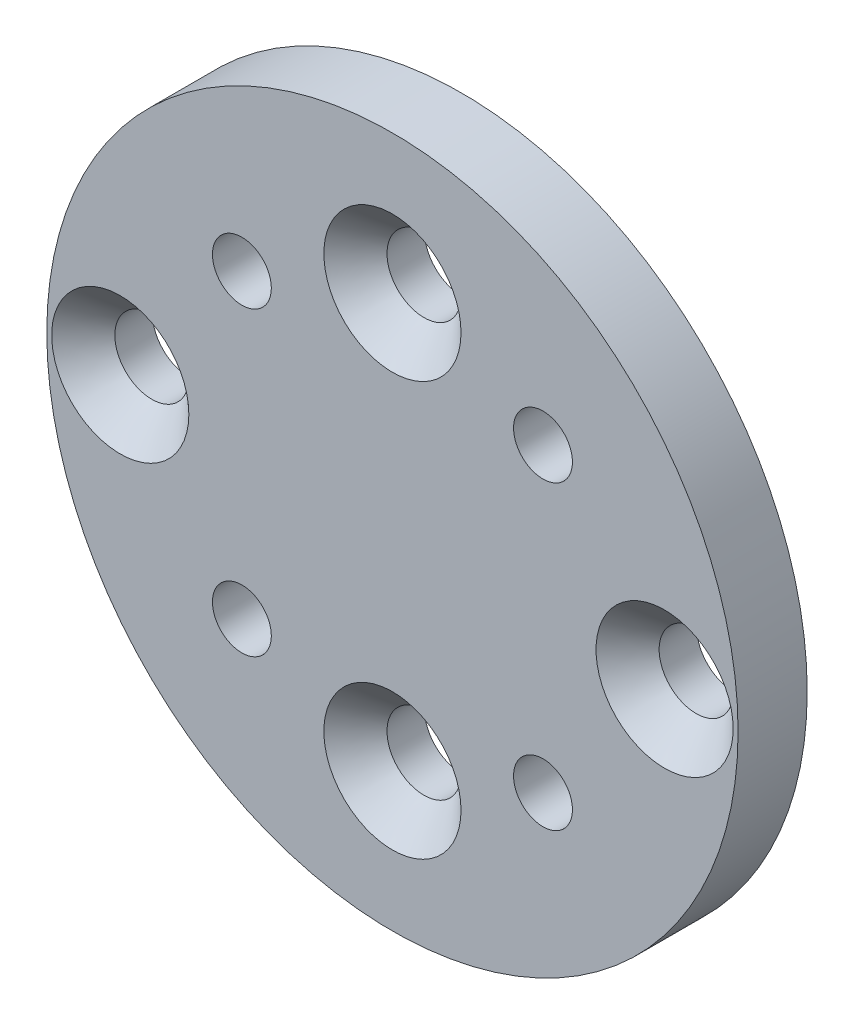
ISO-10303-21;
HEADER;
FILE_DESCRIPTION(('STEP AP214'),'2;1');
FILE_NAME('part.step','',(''),(''),'','','');
FILE_SCHEMA(('AUTOMOTIVE_DESIGN { 1 0 10303 214 1 1 1 1 }'));
ENDSEC;
DATA;
#1=APPLICATION_CONTEXT('core data for automotive mechanical design processes');
#2=APPLICATION_PROTOCOL_DEFINITION('international standard','automotive_design',2000,#1);
#3=PRODUCT_CONTEXT('',#1,'mechanical');
#4=PRODUCT('Part','Part','',(#3));
#5=PRODUCT_RELATED_PRODUCT_CATEGORY('part','',(#4));
#6=PRODUCT_DEFINITION_FORMATION('','',#4);
#7=PRODUCT_DEFINITION_CONTEXT('part definition',#1,'design');
#8=PRODUCT_DEFINITION('design','',#6,#7);
#9=PRODUCT_DEFINITION_SHAPE('','',#8);
#10=(LENGTH_UNIT() NAMED_UNIT(*) SI_UNIT(.MILLI.,.METRE.));
#11=(NAMED_UNIT(*) PLANE_ANGLE_UNIT() SI_UNIT($,.RADIAN.));
#12=(NAMED_UNIT(*) SI_UNIT($,.STERADIAN.) SOLID_ANGLE_UNIT());
#13=UNCERTAINTY_MEASURE_WITH_UNIT(LENGTH_MEASURE(1.E-05),#10,'distance_accuracy_value','');
#14=(GEOMETRIC_REPRESENTATION_CONTEXT(3) GLOBAL_UNCERTAINTY_ASSIGNED_CONTEXT((#13)) GLOBAL_UNIT_ASSIGNED_CONTEXT((#10,
#11,#12)) REPRESENTATION_CONTEXT('',''));
#15=CARTESIAN_POINT('',(0.,0.,0.));
#16=DIRECTION('',(0.,0.,1.));
#17=DIRECTION('',(1.,0.,0.));
#18=AXIS2_PLACEMENT_3D('',#15,#16,#17);
#19=CARTESIAN_POINT('',(0.,0.,3.175));
#20=DIRECTION('',(0.,0.,-1.));
#21=DIRECTION('',(-1.,0.,0.));
#22=AXIS2_PLACEMENT_3D('',#19,#20,#21);
#23=CYLINDRICAL_SURFACE('',#22,15.875);
#24=CARTESIAN_POINT('',(0.,0.,3.175));
#25=DIRECTION('',(0.,0.,1.));
#26=DIRECTION('',(1.,0.,0.));
#27=AXIS2_PLACEMENT_3D('',#24,#25,#26);
#28=CIRCLE('',#27,15.875);
#29=CARTESIAN_POINT('',(15.875,0.,3.175));
#30=VERTEX_POINT('',#29);
#31=EDGE_CURVE('E10',#30,#30,#28,.T.);
#32=ORIENTED_EDGE('',*,*,#31,.F.);
#33=EDGE_LOOP('',(#32));
#34=FACE_BOUND('',#33,.T.);
#35=CARTESIAN_POINT('',(0.,0.,0.));
#36=DIRECTION('',(0.,0.,1.));
#37=DIRECTION('',(1.,0.,0.));
#38=AXIS2_PLACEMENT_3D('',#35,#36,#37);
#39=CIRCLE('',#38,15.875);
#40=CARTESIAN_POINT('',(15.875,0.,0.));
#41=VERTEX_POINT('',#40);
#42=EDGE_CURVE('E34',#41,#41,#39,.T.);
#43=ORIENTED_EDGE('',*,*,#42,.T.);
#44=EDGE_LOOP('',(#43));
#45=FACE_BOUND('',#44,.T.);
#46=ADVANCED_FACE('F31',(#34,#45),#23,.T.);
#47=CARTESIAN_POINT('',(0.,0.,3.175));
#48=DIRECTION('',(0.,0.,1.));
#49=DIRECTION('',(1.,0.,0.));
#50=AXIS2_PLACEMENT_3D('',#47,#48,#49);
#51=PLANE('',#50);
#52=CARTESIAN_POINT('',(-6.91479721322325,6.91479721322325,3.175));
#53=DIRECTION('',(0.,0.,1.));
#54=DIRECTION('',(1.,0.,0.));
#55=AXIS2_PLACEMENT_3D('',#52,#53,#54);
#56=CIRCLE('',#55,1.35254999999999);
#57=CARTESIAN_POINT('',(-5.56224721322326,6.91479721322325,3.175));
#58=VERTEX_POINT('',#57);
#59=EDGE_CURVE('E99',#58,#58,#56,.T.);
#60=ORIENTED_EDGE('',*,*,#59,.F.);
#61=EDGE_LOOP('',(#60));
#62=FACE_BOUND('',#61,.T.);
#63=CARTESIAN_POINT('',(6.91479721322325,6.91479721322325,3.175));
#64=DIRECTION('',(0.,0.,1.));
#65=DIRECTION('',(1.,0.,0.));
#66=AXIS2_PLACEMENT_3D('',#63,#64,#65);
#67=CIRCLE('',#66,1.35254999999999);
#68=CARTESIAN_POINT('',(8.26734721322324,6.91479721322325,3.175));
#69=VERTEX_POINT('',#68);
#70=EDGE_CURVE('E93',#69,#69,#67,.T.);
#71=ORIENTED_EDGE('',*,*,#70,.F.);
#72=EDGE_LOOP('',(#71));
#73=FACE_BOUND('',#72,.T.);
#74=CARTESIAN_POINT('',(6.91479721322325,-6.91479721322325,3.175));
#75=DIRECTION('',(0.,0.,1.));
#76=DIRECTION('',(1.,0.,0.));
#77=AXIS2_PLACEMENT_3D('',#74,#75,#76);
#78=CIRCLE('',#77,1.35254999999999);
#79=CARTESIAN_POINT('',(8.26734721322323,-6.91479721322325,3.175));
#80=VERTEX_POINT('',#79);
#81=EDGE_CURVE('E87',#80,#80,#78,.T.);
#82=ORIENTED_EDGE('',*,*,#81,.F.);
#83=EDGE_LOOP('',(#82));
#84=FACE_BOUND('',#83,.T.);
#85=CARTESIAN_POINT('',(-6.91479721322326,-6.91479721322326,3.175));
#86=DIRECTION('',(0.,0.,1.));
#87=DIRECTION('',(1.,0.,0.));
#88=AXIS2_PLACEMENT_3D('',#85,#86,#87);
#89=CIRCLE('',#88,1.35254999999999);
#90=CARTESIAN_POINT('',(-5.56224721322327,-6.91479721322326,3.175));
#91=VERTEX_POINT('',#90);
#92=EDGE_CURVE('E81',#91,#91,#89,.T.);
#93=ORIENTED_EDGE('',*,*,#92,.F.);
#94=EDGE_LOOP('',(#93));
#95=FACE_BOUND('',#94,.T.);
#96=CARTESIAN_POINT('',(0.,9.5,3.175));
#97=DIRECTION('',(0.,0.,1.));
#98=DIRECTION('',(1.,0.,0.));
#99=AXIS2_PLACEMENT_3D('',#96,#97,#98);
#100=CIRCLE('',#99,3.15);
#101=CARTESIAN_POINT('',(3.15,9.5,3.175));
#102=VERTEX_POINT('',#101);
#103=EDGE_CURVE('E75',#102,#102,#100,.T.);
#104=ORIENTED_EDGE('',*,*,#103,.F.);
#105=EDGE_LOOP('',(#104));
#106=FACE_BOUND('',#105,.T.);
#107=CARTESIAN_POINT('',(0.,-9.5,3.175));
#108=DIRECTION('',(0.,0.,1.));
#109=DIRECTION('',(1.,0.,0.));
#110=AXIS2_PLACEMENT_3D('',#107,#108,#109);
#111=CIRCLE('',#110,3.15);
#112=CARTESIAN_POINT('',(3.15,-9.5,3.175));
#113=VERTEX_POINT('',#112);
#114=EDGE_CURVE('E66',#113,#113,#111,.T.);
#115=ORIENTED_EDGE('',*,*,#114,.F.);
#116=EDGE_LOOP('',(#115));
#117=FACE_BOUND('',#116,.T.);
#118=CARTESIAN_POINT('',(12.5,0.,3.175));
#119=DIRECTION('',(0.,0.,1.));
#120=DIRECTION('',(1.,0.,0.));
#121=AXIS2_PLACEMENT_3D('',#118,#119,#120);
#122=CIRCLE('',#121,3.15);
#123=CARTESIAN_POINT('',(15.65,0.,3.175));
#124=VERTEX_POINT('',#123);
#125=EDGE_CURVE('E57',#124,#124,#122,.T.);
#126=ORIENTED_EDGE('',*,*,#125,.F.);
#127=EDGE_LOOP('',(#126));
#128=FACE_BOUND('',#127,.T.);
#129=CARTESIAN_POINT('',(-12.5,0.,3.175));
#130=DIRECTION('',(0.,0.,1.));
#131=DIRECTION('',(1.,0.,0.));
#132=AXIS2_PLACEMENT_3D('',#129,#130,#131);
#133=CIRCLE('',#132,3.15);
#134=CARTESIAN_POINT('',(-9.35,0.,3.175));
#135=VERTEX_POINT('',#134);
#136=EDGE_CURVE('E48',#135,#135,#133,.T.);
#137=ORIENTED_EDGE('',*,*,#136,.F.);
#138=EDGE_LOOP('',(#137));
#139=FACE_BOUND('',#138,.T.);
#140=ORIENTED_EDGE('',*,*,#31,.T.);
#141=EDGE_LOOP('',(#140));
#142=FACE_BOUND('',#141,.T.);
#143=ADVANCED_FACE('F105',(#62,#73,#84,#95,#106,#117,#128,#139,#142),#51,.T.);
#144=CARTESIAN_POINT('',(0.,0.,0.));
#145=DIRECTION('',(0.,0.,1.));
#146=DIRECTION('',(1.,0.,0.));
#147=AXIS2_PLACEMENT_3D('',#144,#145,#146);
#148=PLANE('',#147);
#149=CARTESIAN_POINT('',(-6.91479721322325,6.91479721322325,0.));
#150=DIRECTION('',(0.,0.,1.));
#151=DIRECTION('',(1.,0.,0.));
#152=AXIS2_PLACEMENT_3D('',#149,#150,#151);
#153=CIRCLE('',#152,1.35255);
#154=CARTESIAN_POINT('',(-5.56224721322325,6.91479721322325,0.));
#155=VERTEX_POINT('',#154);
#156=EDGE_CURVE('E96',#155,#155,#153,.T.);
#157=ORIENTED_EDGE('',*,*,#156,.T.);
#158=EDGE_LOOP('',(#157));
#159=FACE_BOUND('',#158,.T.);
#160=CARTESIAN_POINT('',(6.91479721322325,6.91479721322325,0.));
#161=DIRECTION('',(0.,0.,1.));
#162=DIRECTION('',(1.,0.,0.));
#163=AXIS2_PLACEMENT_3D('',#160,#161,#162);
#164=CIRCLE('',#163,1.35255);
#165=CARTESIAN_POINT('',(8.26734721322325,6.91479721322325,0.));
#166=VERTEX_POINT('',#165);
#167=EDGE_CURVE('E90',#166,#166,#164,.T.);
#168=ORIENTED_EDGE('',*,*,#167,.T.);
#169=EDGE_LOOP('',(#168));
#170=FACE_BOUND('',#169,.T.);
#171=CARTESIAN_POINT('',(6.91479721322325,-6.91479721322325,0.));
#172=DIRECTION('',(0.,0.,1.));
#173=DIRECTION('',(1.,0.,0.));
#174=AXIS2_PLACEMENT_3D('',#171,#172,#173);
#175=CIRCLE('',#174,1.35255);
#176=CARTESIAN_POINT('',(8.26734721322324,-6.91479721322325,0.));
#177=VERTEX_POINT('',#176);
#178=EDGE_CURVE('E84',#177,#177,#175,.T.);
#179=ORIENTED_EDGE('',*,*,#178,.T.);
#180=EDGE_LOOP('',(#179));
#181=FACE_BOUND('',#180,.T.);
#182=CARTESIAN_POINT('',(-6.91479721322326,-6.91479721322326,0.));
#183=DIRECTION('',(0.,0.,1.));
#184=DIRECTION('',(1.,0.,0.));
#185=AXIS2_PLACEMENT_3D('',#182,#183,#184);
#186=CIRCLE('',#185,1.35255);
#187=CARTESIAN_POINT('',(-5.56224721322326,-6.91479721322326,0.));
#188=VERTEX_POINT('',#187);
#189=EDGE_CURVE('E78',#188,#188,#186,.T.);
#190=ORIENTED_EDGE('',*,*,#189,.T.);
#191=EDGE_LOOP('',(#190));
#192=FACE_BOUND('',#191,.T.);
#193=CARTESIAN_POINT('',(0.,9.5,0.));
#194=DIRECTION('',(0.,0.,1.));
#195=DIRECTION('',(1.,0.,0.));
#196=AXIS2_PLACEMENT_3D('',#193,#194,#195);
#197=CIRCLE('',#196,1.7);
#198=CARTESIAN_POINT('',(1.7,9.5,0.));
#199=VERTEX_POINT('',#198);
#200=EDGE_CURVE('E69',#199,#199,#197,.T.);
#201=ORIENTED_EDGE('',*,*,#200,.T.);
#202=EDGE_LOOP('',(#201));
#203=FACE_BOUND('',#202,.T.);
#204=CARTESIAN_POINT('',(0.,-9.5,0.));
#205=DIRECTION('',(0.,0.,1.));
#206=DIRECTION('',(1.,0.,0.));
#207=AXIS2_PLACEMENT_3D('',#204,#205,#206);
#208=CIRCLE('',#207,1.7);
#209=CARTESIAN_POINT('',(1.7,-9.5,0.));
#210=VERTEX_POINT('',#209);
#211=EDGE_CURVE('E60',#210,#210,#208,.T.);
#212=ORIENTED_EDGE('',*,*,#211,.T.);
#213=EDGE_LOOP('',(#212));
#214=FACE_BOUND('',#213,.T.);
#215=CARTESIAN_POINT('',(12.5,0.,0.));
#216=DIRECTION('',(0.,0.,1.));
#217=DIRECTION('',(1.,0.,0.));
#218=AXIS2_PLACEMENT_3D('',#215,#216,#217);
#219=CIRCLE('',#218,1.7);
#220=CARTESIAN_POINT('',(14.2,0.,0.));
#221=VERTEX_POINT('',#220);
#222=EDGE_CURVE('E51',#221,#221,#219,.T.);
#223=ORIENTED_EDGE('',*,*,#222,.T.);
#224=EDGE_LOOP('',(#223));
#225=FACE_BOUND('',#224,.T.);
#226=CARTESIAN_POINT('',(-12.5,0.,0.));
#227=DIRECTION('',(0.,0.,1.));
#228=DIRECTION('',(1.,0.,0.));
#229=AXIS2_PLACEMENT_3D('',#226,#227,#228);
#230=CIRCLE('',#229,1.7);
#231=CARTESIAN_POINT('',(-10.8,0.,0.));
#232=VERTEX_POINT('',#231);
#233=EDGE_CURVE('E41',#232,#232,#230,.T.);
#234=ORIENTED_EDGE('',*,*,#233,.T.);
#235=EDGE_LOOP('',(#234));
#236=FACE_BOUND('',#235,.T.);
#237=ORIENTED_EDGE('',*,*,#42,.F.);
#238=EDGE_LOOP('',(#237));
#239=FACE_BOUND('',#238,.T.);
#240=ADVANCED_FACE('F108',(#159,#170,#181,#192,#203,#214,#225,#236,#239),#148,.F.);
#241=CARTESIAN_POINT('',(-12.5,0.,3.175));
#242=DIRECTION('',(0.,0.,1.));
#243=DIRECTION('',(1.,0.,0.));
#244=AXIS2_PLACEMENT_3D('',#241,#242,#243);
#245=CYLINDRICAL_SURFACE('',#244,1.7);
#246=ORIENTED_EDGE('',*,*,#233,.F.);
#247=EDGE_LOOP('',(#246));
#248=FACE_BOUND('',#247,.T.);
#249=CARTESIAN_POINT('',(-12.5,0.,1.725));
#250=DIRECTION('',(0.,0.,1.));
#251=DIRECTION('',(1.,0.,0.));
#252=AXIS2_PLACEMENT_3D('',#249,#250,#251);
#253=CIRCLE('',#252,1.7);
#254=CARTESIAN_POINT('',(-10.8,0.,1.725));
#255=VERTEX_POINT('',#254);
#256=EDGE_CURVE('E45',#255,#255,#253,.T.);
#257=ORIENTED_EDGE('',*,*,#256,.T.);
#258=EDGE_LOOP('',(#257));
#259=FACE_BOUND('',#258,.T.);
#260=ADVANCED_FACE('F127',(#248,#259),#245,.F.);
#261=CARTESIAN_POINT('',(-12.5,0.,3.175));
#262=DIRECTION('',(0.,0.,1.));
#263=DIRECTION('',(1.,0.,0.));
#264=AXIS2_PLACEMENT_3D('',#261,#262,#263);
#265=CONICAL_SURFACE('',#264,3.15,0.785398163397449);
#266=ORIENTED_EDGE('',*,*,#256,.F.);
#267=EDGE_LOOP('',(#266));
#268=FACE_BOUND('',#267,.T.);
#269=ORIENTED_EDGE('',*,*,#136,.T.);
#270=EDGE_LOOP('',(#269));
#271=FACE_BOUND('',#270,.T.);
#272=ADVANCED_FACE('F124',(#268,#271),#265,.F.);
#273=CARTESIAN_POINT('',(12.5,0.,3.175));
#274=DIRECTION('',(0.,0.,1.));
#275=DIRECTION('',(1.,0.,0.));
#276=AXIS2_PLACEMENT_3D('',#273,#274,#275);
#277=CYLINDRICAL_SURFACE('',#276,1.7);
#278=ORIENTED_EDGE('',*,*,#222,.F.);
#279=EDGE_LOOP('',(#278));
#280=FACE_BOUND('',#279,.T.);
#281=CARTESIAN_POINT('',(12.5,0.,1.725));
#282=DIRECTION('',(0.,0.,1.));
#283=DIRECTION('',(1.,0.,0.));
#284=AXIS2_PLACEMENT_3D('',#281,#282,#283);
#285=CIRCLE('',#284,1.7);
#286=CARTESIAN_POINT('',(14.2,0.,1.725));
#287=VERTEX_POINT('',#286);
#288=EDGE_CURVE('E54',#287,#287,#285,.T.);
#289=ORIENTED_EDGE('',*,*,#288,.T.);
#290=EDGE_LOOP('',(#289));
#291=FACE_BOUND('',#290,.T.);
#292=ADVANCED_FACE('F126',(#280,#291),#277,.F.);
#293=CARTESIAN_POINT('',(12.5,0.,3.175));
#294=DIRECTION('',(0.,0.,1.));
#295=DIRECTION('',(1.,0.,0.));
#296=AXIS2_PLACEMENT_3D('',#293,#294,#295);
#297=CONICAL_SURFACE('',#296,3.15,0.785398163397449);
#298=ORIENTED_EDGE('',*,*,#288,.F.);
#299=EDGE_LOOP('',(#298));
#300=FACE_BOUND('',#299,.T.);
#301=ORIENTED_EDGE('',*,*,#125,.T.);
#302=EDGE_LOOP('',(#301));
#303=FACE_BOUND('',#302,.T.);
#304=ADVANCED_FACE('F134',(#300,#303),#297,.F.);
#305=CARTESIAN_POINT('',(0.,-9.5,3.175));
#306=DIRECTION('',(0.,0.,1.));
#307=DIRECTION('',(1.,0.,0.));
#308=AXIS2_PLACEMENT_3D('',#305,#306,#307);
#309=CYLINDRICAL_SURFACE('',#308,1.7);
#310=ORIENTED_EDGE('',*,*,#211,.F.);
#311=EDGE_LOOP('',(#310));
#312=FACE_BOUND('',#311,.T.);
#313=CARTESIAN_POINT('',(0.,-9.5,1.725));
#314=DIRECTION('',(0.,0.,1.));
#315=DIRECTION('',(1.,0.,0.));
#316=AXIS2_PLACEMENT_3D('',#313,#314,#315);
#317=CIRCLE('',#316,1.7);
#318=CARTESIAN_POINT('',(1.7,-9.5,1.725));
#319=VERTEX_POINT('',#318);
#320=EDGE_CURVE('E63',#319,#319,#317,.T.);
#321=ORIENTED_EDGE('',*,*,#320,.T.);
#322=EDGE_LOOP('',(#321));
#323=FACE_BOUND('',#322,.T.);
#324=ADVANCED_FACE('F172',(#312,#323),#309,.F.);
#325=CARTESIAN_POINT('',(0.,-9.5,3.175));
#326=DIRECTION('',(0.,0.,1.));
#327=DIRECTION('',(1.,0.,0.));
#328=AXIS2_PLACEMENT_3D('',#325,#326,#327);
#329=CONICAL_SURFACE('',#328,3.15,0.785398163397449);
#330=ORIENTED_EDGE('',*,*,#320,.F.);
#331=EDGE_LOOP('',(#330));
#332=FACE_BOUND('',#331,.T.);
#333=ORIENTED_EDGE('',*,*,#114,.T.);
#334=EDGE_LOOP('',(#333));
#335=FACE_BOUND('',#334,.T.);
#336=ADVANCED_FACE('F177',(#332,#335),#329,.F.);
#337=CARTESIAN_POINT('',(0.,9.5,3.175));
#338=DIRECTION('',(0.,0.,1.));
#339=DIRECTION('',(1.,0.,0.));
#340=AXIS2_PLACEMENT_3D('',#337,#338,#339);
#341=CYLINDRICAL_SURFACE('',#340,1.7);
#342=ORIENTED_EDGE('',*,*,#200,.F.);
#343=EDGE_LOOP('',(#342));
#344=FACE_BOUND('',#343,.T.);
#345=CARTESIAN_POINT('',(0.,9.5,1.725));
#346=DIRECTION('',(0.,0.,1.));
#347=DIRECTION('',(1.,0.,0.));
#348=AXIS2_PLACEMENT_3D('',#345,#346,#347);
#349=CIRCLE('',#348,1.7);
#350=CARTESIAN_POINT('',(1.7,9.5,1.725));
#351=VERTEX_POINT('',#350);
#352=EDGE_CURVE('E72',#351,#351,#349,.T.);
#353=ORIENTED_EDGE('',*,*,#352,.T.);
#354=EDGE_LOOP('',(#353));
#355=FACE_BOUND('',#354,.T.);
#356=ADVANCED_FACE('F183',(#344,#355),#341,.F.);
#357=CARTESIAN_POINT('',(0.,9.5,3.175));
#358=DIRECTION('',(0.,0.,1.));
#359=DIRECTION('',(1.,0.,0.));
#360=AXIS2_PLACEMENT_3D('',#357,#358,#359);
#361=CONICAL_SURFACE('',#360,3.15,0.785398163397449);
#362=ORIENTED_EDGE('',*,*,#352,.F.);
#363=EDGE_LOOP('',(#362));
#364=FACE_BOUND('',#363,.T.);
#365=ORIENTED_EDGE('',*,*,#103,.T.);
#366=EDGE_LOOP('',(#365));
#367=FACE_BOUND('',#366,.T.);
#368=ADVANCED_FACE('F187',(#364,#367),#361,.F.);
#369=CARTESIAN_POINT('',(-6.91479721322326,-6.91479721322326,3.175));
#370=DIRECTION('',(0.,0.,1.));
#371=DIRECTION('',(1.,0.,0.));
#372=AXIS2_PLACEMENT_3D('',#369,#370,#371);
#373=CYLINDRICAL_SURFACE('',#372,1.35254999999999);
#374=ORIENTED_EDGE('',*,*,#189,.F.);
#375=EDGE_LOOP('',(#374));
#376=FACE_BOUND('',#375,.T.);
#377=ORIENTED_EDGE('',*,*,#92,.T.);
#378=EDGE_LOOP('',(#377));
#379=FACE_BOUND('',#378,.T.);
#380=ADVANCED_FACE('F191',(#376,#379),#373,.F.);
#381=CARTESIAN_POINT('',(6.91479721322325,-6.91479721322325,3.175));
#382=DIRECTION('',(0.,0.,1.));
#383=DIRECTION('',(1.,0.,0.));
#384=AXIS2_PLACEMENT_3D('',#381,#382,#383);
#385=CYLINDRICAL_SURFACE('',#384,1.35254999999999);
#386=ORIENTED_EDGE('',*,*,#178,.F.);
#387=EDGE_LOOP('',(#386));
#388=FACE_BOUND('',#387,.T.);
#389=ORIENTED_EDGE('',*,*,#81,.T.);
#390=EDGE_LOOP('',(#389));
#391=FACE_BOUND('',#390,.T.);
#392=ADVANCED_FACE('F195',(#388,#391),#385,.F.);
#393=CARTESIAN_POINT('',(6.91479721322325,6.91479721322325,3.175));
#394=DIRECTION('',(0.,0.,1.));
#395=DIRECTION('',(1.,0.,0.));
#396=AXIS2_PLACEMENT_3D('',#393,#394,#395);
#397=CYLINDRICAL_SURFACE('',#396,1.35254999999999);
#398=ORIENTED_EDGE('',*,*,#167,.F.);
#399=EDGE_LOOP('',(#398));
#400=FACE_BOUND('',#399,.T.);
#401=ORIENTED_EDGE('',*,*,#70,.T.);
#402=EDGE_LOOP('',(#401));
#403=FACE_BOUND('',#402,.T.);
#404=ADVANCED_FACE('F199',(#400,#403),#397,.F.);
#405=CARTESIAN_POINT('',(-6.91479721322325,6.91479721322325,3.175));
#406=DIRECTION('',(0.,0.,1.));
#407=DIRECTION('',(1.,0.,0.));
#408=AXIS2_PLACEMENT_3D('',#405,#406,#407);
#409=CYLINDRICAL_SURFACE('',#408,1.35254999999999);
#410=ORIENTED_EDGE('',*,*,#156,.F.);
#411=EDGE_LOOP('',(#410));
#412=FACE_BOUND('',#411,.T.);
#413=ORIENTED_EDGE('',*,*,#59,.T.);
#414=EDGE_LOOP('',(#413));
#415=FACE_BOUND('',#414,.T.);
#416=ADVANCED_FACE('F103',(#412,#415),#409,.F.);
#417=CLOSED_SHELL('',(#46,#143,#240,#260,#272,#292,#304,#324,#336,#356,#368,#380,#392,#404,#416));
#418=MANIFOLD_SOLID_BREP('B2',#417);
#419=ADVANCED_BREP_SHAPE_REPRESENTATION('',(#18,#418),#14);
#420=SHAPE_DEFINITION_REPRESENTATION(#9,#419);
ENDSEC;
END-ISO-10303-21;
